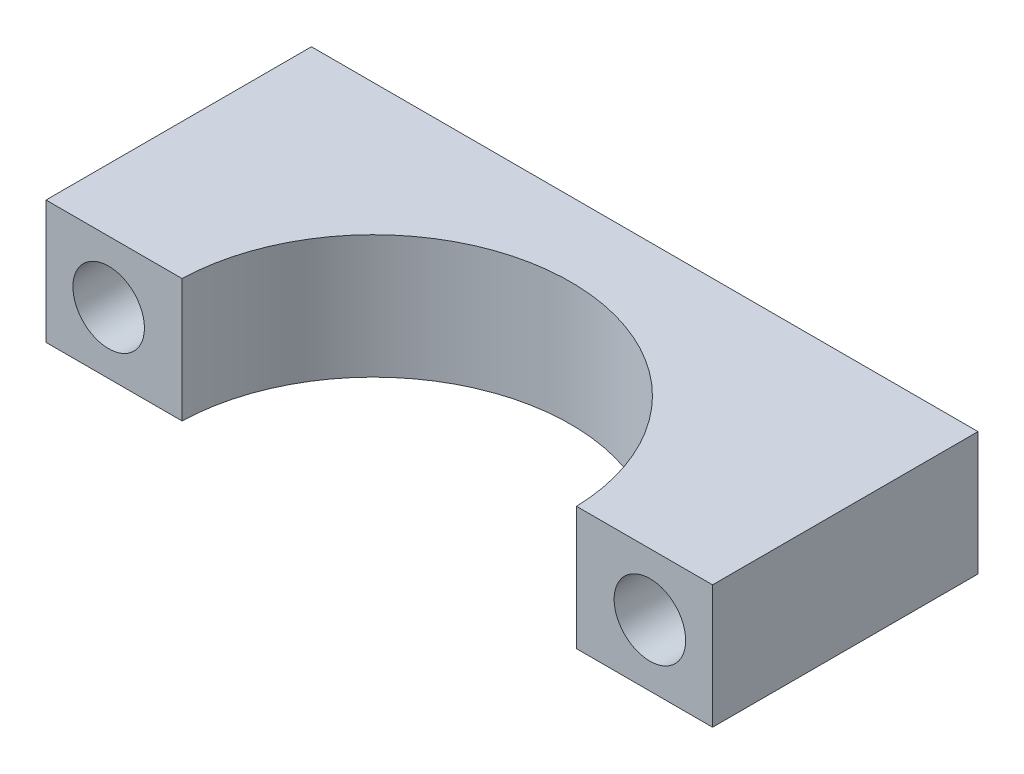
ISO-10303-21;
HEADER;
FILE_DESCRIPTION(('STEP AP214'),'2;1');
FILE_NAME('part.step','',(''),(''),'','','');
FILE_SCHEMA(('AUTOMOTIVE_DESIGN { 1 0 10303 214 1 1 1 1 }'));
ENDSEC;
DATA;
#1=APPLICATION_CONTEXT('core data for automotive mechanical design processes');
#2=APPLICATION_PROTOCOL_DEFINITION('international standard','automotive_design',2000,#1);
#3=PRODUCT_CONTEXT('',#1,'mechanical');
#4=PRODUCT('Part','Part','',(#3));
#5=PRODUCT_RELATED_PRODUCT_CATEGORY('part','',(#4));
#6=PRODUCT_DEFINITION_FORMATION('','',#4);
#7=PRODUCT_DEFINITION_CONTEXT('part definition',#1,'design');
#8=PRODUCT_DEFINITION('design','',#6,#7);
#9=PRODUCT_DEFINITION_SHAPE('','',#8);
#10=(LENGTH_UNIT() NAMED_UNIT(*) SI_UNIT(.MILLI.,.METRE.));
#11=(NAMED_UNIT(*) PLANE_ANGLE_UNIT() SI_UNIT($,.RADIAN.));
#12=(NAMED_UNIT(*) SI_UNIT($,.STERADIAN.) SOLID_ANGLE_UNIT());
#13=UNCERTAINTY_MEASURE_WITH_UNIT(LENGTH_MEASURE(1.E-05),#10,'distance_accuracy_value','');
#14=(GEOMETRIC_REPRESENTATION_CONTEXT(3) GLOBAL_UNCERTAINTY_ASSIGNED_CONTEXT((#13)) GLOBAL_UNIT_ASSIGNED_CONTEXT((#10,
#11,#12)) REPRESENTATION_CONTEXT('',''));
#15=CARTESIAN_POINT('',(0.,0.,0.));
#16=DIRECTION('',(0.,0.,1.));
#17=DIRECTION('',(1.,0.,0.));
#18=AXIS2_PLACEMENT_3D('',#15,#16,#17);
#19=CARTESIAN_POINT('',(0.,0.,-5.62));
#20=DIRECTION('',(0.,1.,0.));
#21=DIRECTION('',(1.,0.,0.));
#22=AXIS2_PLACEMENT_3D('',#19,#20,#21);
#23=PLANE('',#22);
#24=DIRECTION('',(0.,0.,1.));
#25=VECTOR('',#24,1.);
#26=CARTESIAN_POINT('',(13.51,0.,-11.));
#27=LINE('',#26,#25);
#28=CARTESIAN_POINT('',(13.51,0.,-11.));
#29=VERTEX_POINT('',#28);
#30=CARTESIAN_POINT('',(13.51,0.,-0.24));
#31=VERTEX_POINT('',#30);
#32=EDGE_CURVE('E27',#29,#31,#27,.T.);
#33=ORIENTED_EDGE('',*,*,#32,.T.);
#34=DIRECTION('',(-1.,0.,0.));
#35=VECTOR('',#34,1.);
#36=CARTESIAN_POINT('',(13.51,0.,-0.24));
#37=LINE('',#36,#35);
#38=CARTESIAN_POINT('',(7.9963991896353,0.,-0.24));
#39=VERTEX_POINT('',#38);
#40=EDGE_CURVE('E194',#31,#39,#37,.T.);
#41=ORIENTED_EDGE('',*,*,#40,.T.);
#42=CARTESIAN_POINT('',(0.,0.,0.));
#43=DIRECTION('',(0.,1.,0.));
#44=DIRECTION('',(1.,0.,0.));
#45=AXIS2_PLACEMENT_3D('',#42,#43,#44);
#46=CIRCLE('',#45,8.);
#47=CARTESIAN_POINT('',(-7.9963991896353,0.,-0.239999999999991));
#48=VERTEX_POINT('',#47);
#49=EDGE_CURVE('E85',#39,#48,#46,.T.);
#50=ORIENTED_EDGE('',*,*,#49,.T.);
#51=DIRECTION('',(-1.,0.,0.));
#52=VECTOR('',#51,1.);
#53=CARTESIAN_POINT('',(-7.9963991896353,0.,-0.239999999999991));
#54=LINE('',#53,#52);
#55=CARTESIAN_POINT('',(-13.51,0.,-0.239999999999991));
#56=VERTEX_POINT('',#55);
#57=EDGE_CURVE('E138',#48,#56,#54,.T.);
#58=ORIENTED_EDGE('',*,*,#57,.T.);
#59=DIRECTION('',(0.,0.,-1.));
#60=VECTOR('',#59,1.);
#61=CARTESIAN_POINT('',(-13.51,0.,-0.239999999999991));
#62=LINE('',#61,#60);
#63=CARTESIAN_POINT('',(-13.51,0.,-11.));
#64=VERTEX_POINT('',#63);
#65=EDGE_CURVE('E131',#56,#64,#62,.T.);
#66=ORIENTED_EDGE('',*,*,#65,.T.);
#67=DIRECTION('',(1.,0.,0.));
#68=VECTOR('',#67,1.);
#69=CARTESIAN_POINT('',(-13.51,0.,-11.));
#70=LINE('',#69,#68);
#71=EDGE_CURVE('E116',#64,#29,#70,.T.);
#72=ORIENTED_EDGE('',*,*,#71,.T.);
#73=EDGE_LOOP('',(#33,#41,#50,#58,#66,#72));
#74=FACE_BOUND('',#73,.T.);
#75=ADVANCED_FACE('F16',(#74),#23,.F.);
#76=CARTESIAN_POINT('',(0.,5.,-5.62));
#77=DIRECTION('',(0.,1.,0.));
#78=DIRECTION('',(1.,0.,0.));
#79=AXIS2_PLACEMENT_3D('',#76,#77,#78);
#80=PLANE('',#79);
#81=DIRECTION('',(0.,0.,-1.));
#82=VECTOR('',#81,1.);
#83=CARTESIAN_POINT('',(13.51,5.,-11.));
#84=LINE('',#83,#82);
#85=CARTESIAN_POINT('',(13.51,5.,-0.24));
#86=VERTEX_POINT('',#85);
#87=CARTESIAN_POINT('',(13.51,5.,-11.));
#88=VERTEX_POINT('',#87);
#89=EDGE_CURVE('E11',#86,#88,#84,.T.);
#90=ORIENTED_EDGE('',*,*,#89,.T.);
#91=DIRECTION('',(-1.,0.,0.));
#92=VECTOR('',#91,1.);
#93=CARTESIAN_POINT('',(-13.51,5.,-11.));
#94=LINE('',#93,#92);
#95=CARTESIAN_POINT('',(-13.51,5.,-11.));
#96=VERTEX_POINT('',#95);
#97=EDGE_CURVE('E126',#88,#96,#94,.T.);
#98=ORIENTED_EDGE('',*,*,#97,.T.);
#99=DIRECTION('',(0.,0.,1.));
#100=VECTOR('',#99,1.);
#101=CARTESIAN_POINT('',(-13.51,5.,-0.239999999999991));
#102=LINE('',#101,#100);
#103=CARTESIAN_POINT('',(-13.51,5.,-0.239999999999991));
#104=VERTEX_POINT('',#103);
#105=EDGE_CURVE('E133',#96,#104,#102,.T.);
#106=ORIENTED_EDGE('',*,*,#105,.T.);
#107=DIRECTION('',(1.,0.,0.));
#108=VECTOR('',#107,1.);
#109=CARTESIAN_POINT('',(-7.9963991896353,5.,-0.239999999999991));
#110=LINE('',#109,#108);
#111=CARTESIAN_POINT('',(-7.99639918963529,5.,-0.239999999999991));
#112=VERTEX_POINT('',#111);
#113=EDGE_CURVE('E148',#104,#112,#110,.T.);
#114=ORIENTED_EDGE('',*,*,#113,.T.);
#115=CARTESIAN_POINT('',(0.,5.,0.));
#116=DIRECTION('',(0.,-1.,0.));
#117=DIRECTION('',(1.,0.,0.));
#118=AXIS2_PLACEMENT_3D('',#115,#116,#117);
#119=CIRCLE('',#118,8.);
#120=CARTESIAN_POINT('',(7.9963991896353,5.,-0.24));
#121=VERTEX_POINT('',#120);
#122=EDGE_CURVE('E180',#112,#121,#119,.T.);
#123=ORIENTED_EDGE('',*,*,#122,.T.);
#124=DIRECTION('',(1.,0.,0.));
#125=VECTOR('',#124,1.);
#126=CARTESIAN_POINT('',(13.51,5.,-0.24));
#127=LINE('',#126,#125);
#128=EDGE_CURVE('E184',#121,#86,#127,.T.);
#129=ORIENTED_EDGE('',*,*,#128,.T.);
#130=EDGE_LOOP('',(#90,#98,#106,#114,#123,#129));
#131=FACE_BOUND('',#130,.T.);
#132=ADVANCED_FACE('F18',(#131),#80,.T.);
#133=CARTESIAN_POINT('',(13.51,0.,-0.24));
#134=DIRECTION('',(1.,0.,0.));
#135=DIRECTION('',(0.,0.,-1.));
#136=AXIS2_PLACEMENT_3D('',#133,#134,#135);
#137=PLANE('',#136);
#138=ORIENTED_EDGE('',*,*,#32,.F.);
#139=DIRECTION('',(0.,1.,0.));
#140=VECTOR('',#139,1.);
#141=CARTESIAN_POINT('',(13.51,0.,-11.));
#142=LINE('',#141,#140);
#143=EDGE_CURVE('E122',#29,#88,#142,.T.);
#144=ORIENTED_EDGE('',*,*,#143,.T.);
#145=ORIENTED_EDGE('',*,*,#89,.F.);
#146=DIRECTION('',(0.,1.,0.));
#147=VECTOR('',#146,1.);
#148=CARTESIAN_POINT('',(13.51,0.,-0.24));
#149=LINE('',#148,#147);
#150=EDGE_CURVE('E151',#31,#86,#149,.T.);
#151=ORIENTED_EDGE('',*,*,#150,.F.);
#152=EDGE_LOOP('',(#138,#144,#145,#151));
#153=FACE_BOUND('',#152,.T.);
#154=ADVANCED_FACE('F219',(#153),#137,.T.);
#155=CARTESIAN_POINT('',(13.51,0.,-11.));
#156=DIRECTION('',(0.,0.,-1.));
#157=DIRECTION('',(-1.,0.,0.));
#158=AXIS2_PLACEMENT_3D('',#155,#156,#157);
#159=PLANE('',#158);
#160=CARTESIAN_POINT('',(10.97,2.5,-11.));
#161=DIRECTION('',(0.,0.,1.));
#162=DIRECTION('',(-1.,0.,0.));
#163=AXIS2_PLACEMENT_3D('',#160,#161,#162);
#164=CIRCLE('',#163,1.45);
#165=CARTESIAN_POINT('',(9.52,2.5,-11.));
#166=VERTEX_POINT('',#165);
#167=CARTESIAN_POINT('',(12.42,2.5,-11.));
#168=VERTEX_POINT('',#167);
#169=EDGE_CURVE('E155',#166,#168,#164,.T.);
#170=ORIENTED_EDGE('',*,*,#169,.T.);
#171=CARTESIAN_POINT('',(10.97,2.5,-11.));
#172=DIRECTION('',(0.,0.,1.));
#173=DIRECTION('',(-1.,0.,0.));
#174=AXIS2_PLACEMENT_3D('',#171,#172,#173);
#175=CIRCLE('',#174,1.45);
#176=EDGE_CURVE('E164',#168,#166,#175,.T.);
#177=ORIENTED_EDGE('',*,*,#176,.T.);
#178=EDGE_LOOP('',(#170,#177));
#179=FACE_BOUND('',#178,.T.);
#180=CARTESIAN_POINT('',(-10.97,2.5,-11.));
#181=DIRECTION('',(0.,0.,1.));
#182=DIRECTION('',(-1.,0.,0.));
#183=AXIS2_PLACEMENT_3D('',#180,#181,#182);
#184=CIRCLE('',#183,1.45);
#185=CARTESIAN_POINT('',(-12.42,2.5,-11.));
#186=VERTEX_POINT('',#185);
#187=CARTESIAN_POINT('',(-9.52,2.5,-11.));
#188=VERTEX_POINT('',#187);
#189=EDGE_CURVE('E174',#186,#188,#184,.T.);
#190=ORIENTED_EDGE('',*,*,#189,.T.);
#191=CARTESIAN_POINT('',(-10.97,2.5,-11.));
#192=DIRECTION('',(0.,0.,1.));
#193=DIRECTION('',(-1.,0.,0.));
#194=AXIS2_PLACEMENT_3D('',#191,#192,#193);
#195=CIRCLE('',#194,1.45);
#196=EDGE_CURVE('E167',#188,#186,#195,.T.);
#197=ORIENTED_EDGE('',*,*,#196,.T.);
#198=EDGE_LOOP('',(#190,#197));
#199=FACE_BOUND('',#198,.T.);
#200=ORIENTED_EDGE('',*,*,#71,.F.);
#201=DIRECTION('',(0.,1.,0.));
#202=VECTOR('',#201,1.);
#203=CARTESIAN_POINT('',(-13.51,0.,-11.));
#204=LINE('',#203,#202);
#205=EDGE_CURVE('E120',#64,#96,#204,.T.);
#206=ORIENTED_EDGE('',*,*,#205,.T.);
#207=ORIENTED_EDGE('',*,*,#97,.F.);
#208=ORIENTED_EDGE('',*,*,#143,.F.);
#209=EDGE_LOOP('',(#200,#206,#207,#208));
#210=FACE_BOUND('',#209,.T.);
#211=ADVANCED_FACE('F118',(#179,#199,#210),#159,.T.);
#212=CARTESIAN_POINT('',(-13.51,0.,-11.));
#213=DIRECTION('',(-1.,0.,0.));
#214=DIRECTION('',(0.,0.,1.));
#215=AXIS2_PLACEMENT_3D('',#212,#213,#214);
#216=PLANE('',#215);
#217=ORIENTED_EDGE('',*,*,#65,.F.);
#218=DIRECTION('',(0.,1.,0.));
#219=VECTOR('',#218,1.);
#220=CARTESIAN_POINT('',(-13.51,0.,-0.239999999999991));
#221=LINE('',#220,#219);
#222=EDGE_CURVE('E140',#56,#104,#221,.T.);
#223=ORIENTED_EDGE('',*,*,#222,.T.);
#224=ORIENTED_EDGE('',*,*,#105,.F.);
#225=ORIENTED_EDGE('',*,*,#205,.F.);
#226=EDGE_LOOP('',(#217,#223,#224,#225));
#227=FACE_BOUND('',#226,.T.);
#228=ADVANCED_FACE('F129',(#227),#216,.T.);
#229=CARTESIAN_POINT('',(-13.51,0.,-0.239999999999991));
#230=DIRECTION('',(0.,0.,1.));
#231=DIRECTION('',(1.,0.,0.));
#232=AXIS2_PLACEMENT_3D('',#229,#230,#231);
#233=PLANE('',#232);
#234=CARTESIAN_POINT('',(-10.97,2.5,-0.239999999999992));
#235=DIRECTION('',(0.,0.,-1.));
#236=DIRECTION('',(-1.,0.,0.));
#237=AXIS2_PLACEMENT_3D('',#234,#235,#236);
#238=CIRCLE('',#237,1.45);
#239=CARTESIAN_POINT('',(-9.52,2.5,-0.239999999999993));
#240=VERTEX_POINT('',#239);
#241=EDGE_CURVE('E153',#240,#240,#238,.T.);
#242=ORIENTED_EDGE('',*,*,#241,.T.);
#243=EDGE_LOOP('',(#242));
#244=FACE_BOUND('',#243,.T.);
#245=ORIENTED_EDGE('',*,*,#57,.F.);
#246=DIRECTION('',(0.,1.,0.));
#247=VECTOR('',#246,1.);
#248=CARTESIAN_POINT('',(-7.9963991896353,0.,-0.239999999999991));
#249=LINE('',#248,#247);
#250=EDGE_CURVE('E182',#48,#112,#249,.T.);
#251=ORIENTED_EDGE('',*,*,#250,.T.);
#252=ORIENTED_EDGE('',*,*,#113,.F.);
#253=ORIENTED_EDGE('',*,*,#222,.F.);
#254=EDGE_LOOP('',(#245,#251,#252,#253));
#255=FACE_BOUND('',#254,.T.);
#256=ADVANCED_FACE('F222',(#244,#255),#233,.T.);
#257=CARTESIAN_POINT('',(0.,0.,0.));
#258=DIRECTION('',(0.,1.,0.));
#259=DIRECTION('',(1.,0.,0.));
#260=AXIS2_PLACEMENT_3D('',#257,#258,#259);
#261=CYLINDRICAL_SURFACE('',#260,8.);
#262=ORIENTED_EDGE('',*,*,#49,.F.);
#263=DIRECTION('',(0.,1.,0.));
#264=VECTOR('',#263,1.);
#265=CARTESIAN_POINT('',(7.9963991896353,0.,-0.24));
#266=LINE('',#265,#264);
#267=EDGE_CURVE('E187',#39,#121,#266,.T.);
#268=ORIENTED_EDGE('',*,*,#267,.T.);
#269=ORIENTED_EDGE('',*,*,#122,.F.);
#270=ORIENTED_EDGE('',*,*,#250,.F.);
#271=EDGE_LOOP('',(#262,#268,#269,#270));
#272=FACE_BOUND('',#271,.T.);
#273=ADVANCED_FACE('F225',(#272),#261,.F.);
#274=CARTESIAN_POINT('',(7.9963991896353,0.,-0.24));
#275=DIRECTION('',(0.,0.,1.));
#276=DIRECTION('',(1.,0.,0.));
#277=AXIS2_PLACEMENT_3D('',#274,#275,#276);
#278=PLANE('',#277);
#279=CARTESIAN_POINT('',(10.97,2.5,-0.24));
#280=DIRECTION('',(0.,0.,-1.));
#281=DIRECTION('',(-1.,0.,0.));
#282=AXIS2_PLACEMENT_3D('',#279,#280,#281);
#283=CIRCLE('',#282,1.45);
#284=CARTESIAN_POINT('',(12.42,2.5,-0.24));
#285=VERTEX_POINT('',#284);
#286=EDGE_CURVE('E178',#285,#285,#283,.T.);
#287=ORIENTED_EDGE('',*,*,#286,.T.);
#288=EDGE_LOOP('',(#287));
#289=FACE_BOUND('',#288,.T.);
#290=ORIENTED_EDGE('',*,*,#40,.F.);
#291=ORIENTED_EDGE('',*,*,#150,.T.);
#292=ORIENTED_EDGE('',*,*,#128,.F.);
#293=ORIENTED_EDGE('',*,*,#267,.F.);
#294=EDGE_LOOP('',(#290,#291,#292,#293));
#295=FACE_BOUND('',#294,.T.);
#296=ADVANCED_FACE('F211',(#289,#295),#278,.T.);
#297=CARTESIAN_POINT('',(10.97,2.5,-5.082));
#298=DIRECTION('',(0.,0.,1.));
#299=DIRECTION('',(-1.,0.,0.));
#300=AXIS2_PLACEMENT_3D('',#297,#298,#299);
#301=CYLINDRICAL_SURFACE('',#300,1.45);
#302=ORIENTED_EDGE('',*,*,#169,.F.);
#303=ORIENTED_EDGE('',*,*,#176,.F.);
#304=DIRECTION('',(0.,0.,1.));
#305=VECTOR('',#304,1.);
#306=CARTESIAN_POINT('',(12.42,2.5,-5.082));
#307=LINE('',#306,#305);
#308=EDGE_CURVE('E20',#168,#285,#307,.T.);
#309=ORIENTED_EDGE('',*,*,#308,.T.);
#310=ORIENTED_EDGE('',*,*,#286,.F.);
#311=ORIENTED_EDGE('',*,*,#308,.F.);
#312=EDGE_LOOP('',(#302,#303,#309,#310,#311));
#313=FACE_BOUND('',#312,.T.);
#314=ADVANCED_FACE('F205',(#313),#301,.F.);
#315=CARTESIAN_POINT('',(-10.97,2.5,-5.082));
#316=DIRECTION('',(0.,0.,1.));
#317=DIRECTION('',(-1.,0.,0.));
#318=AXIS2_PLACEMENT_3D('',#315,#316,#317);
#319=CYLINDRICAL_SURFACE('',#318,1.45);
#320=ORIENTED_EDGE('',*,*,#189,.F.);
#321=ORIENTED_EDGE('',*,*,#196,.F.);
#322=DIRECTION('',(0.,0.,1.));
#323=VECTOR('',#322,1.);
#324=CARTESIAN_POINT('',(-9.52,2.5,-5.082));
#325=LINE('',#324,#323);
#326=EDGE_CURVE('E156',#188,#240,#325,.T.);
#327=ORIENTED_EDGE('',*,*,#326,.T.);
#328=ORIENTED_EDGE('',*,*,#241,.F.);
#329=ORIENTED_EDGE('',*,*,#326,.F.);
#330=EDGE_LOOP('',(#320,#321,#327,#328,#329));
#331=FACE_BOUND('',#330,.T.);
#332=ADVANCED_FACE('F203',(#331),#319,.F.);
#333=CLOSED_SHELL('',(#75,#132,#154,#211,#228,#256,#273,#296,#314,#332));
#334=MANIFOLD_SOLID_BREP('B1',#333);
#335=ADVANCED_BREP_SHAPE_REPRESENTATION('',(#18,#334),#14);
#336=SHAPE_DEFINITION_REPRESENTATION(#9,#335);
ENDSEC;
END-ISO-10303-21;
